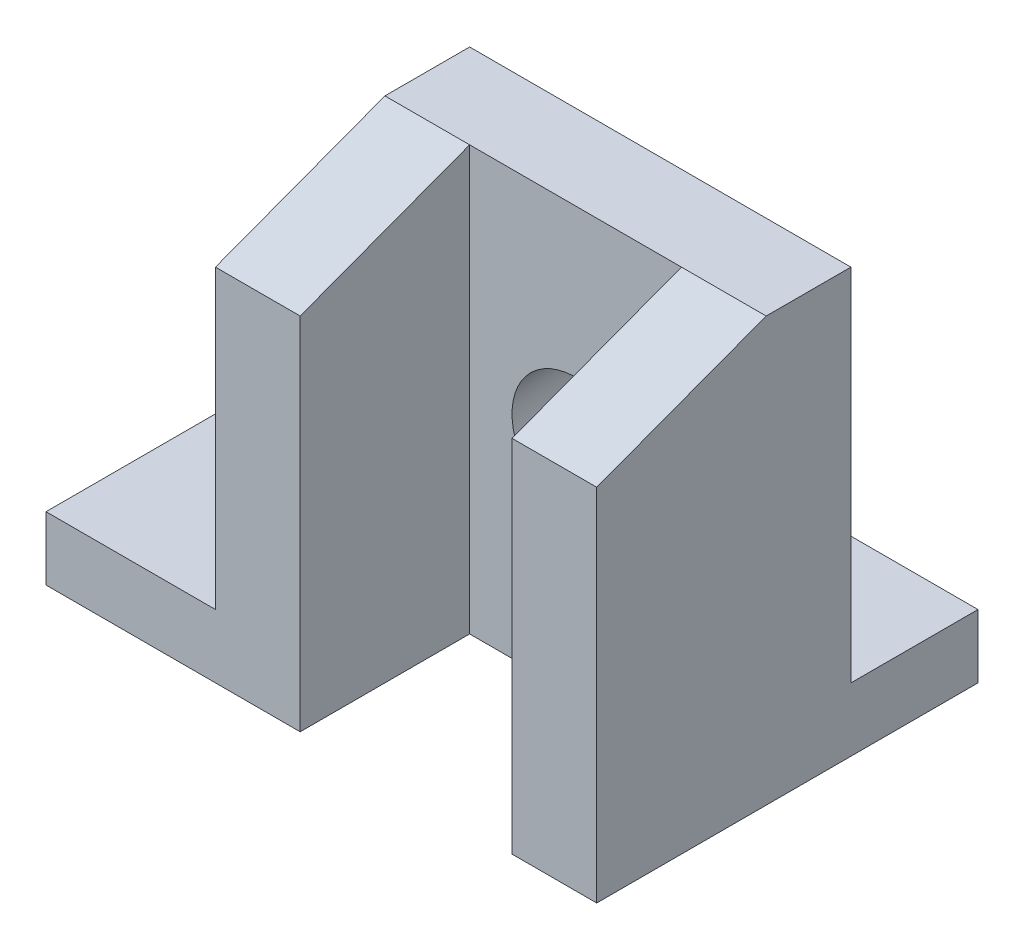
ISO-10303-21;
HEADER;
FILE_DESCRIPTION(('STEP AP214'),'2;1');
FILE_NAME('part.step','',(''),(''),'','','');
FILE_SCHEMA(('AUTOMOTIVE_DESIGN { 1 0 10303 214 1 1 1 1 }'));
ENDSEC;
DATA;
#1=APPLICATION_CONTEXT('core data for automotive mechanical design processes');
#2=APPLICATION_PROTOCOL_DEFINITION('international standard','automotive_design',2000,#1);
#3=PRODUCT_CONTEXT('',#1,'mechanical');
#4=PRODUCT('Part','Part','',(#3));
#5=PRODUCT_RELATED_PRODUCT_CATEGORY('part','',(#4));
#6=PRODUCT_DEFINITION_FORMATION('','',#4);
#7=PRODUCT_DEFINITION_CONTEXT('part definition',#1,'design');
#8=PRODUCT_DEFINITION('design','',#6,#7);
#9=PRODUCT_DEFINITION_SHAPE('','',#8);
#10=(LENGTH_UNIT() NAMED_UNIT(*) SI_UNIT(.MILLI.,.METRE.));
#11=(NAMED_UNIT(*) PLANE_ANGLE_UNIT() SI_UNIT($,.RADIAN.));
#12=(NAMED_UNIT(*) SI_UNIT($,.STERADIAN.) SOLID_ANGLE_UNIT());
#13=UNCERTAINTY_MEASURE_WITH_UNIT(LENGTH_MEASURE(1.E-05),#10,'distance_accuracy_value','');
#14=(GEOMETRIC_REPRESENTATION_CONTEXT(3) GLOBAL_UNCERTAINTY_ASSIGNED_CONTEXT((#13)) GLOBAL_UNIT_ASSIGNED_CONTEXT((#10,
#11,#12)) REPRESENTATION_CONTEXT('',''));
#15=CARTESIAN_POINT('',(0.,0.,0.));
#16=DIRECTION('',(0.,0.,1.));
#17=DIRECTION('',(1.,0.,0.));
#18=AXIS2_PLACEMENT_3D('',#15,#16,#17);
#19=CARTESIAN_POINT('',(0.,0.,-8.));
#20=DIRECTION('',(0.,0.,-1.));
#21=DIRECTION('',(-1.,0.,0.));
#22=AXIS2_PLACEMENT_3D('',#19,#20,#21);
#23=PLANE('',#22);
#24=CARTESIAN_POINT('',(0.,0.,-8.));
#25=DIRECTION('',(0.,0.,1.));
#26=DIRECTION('',(1.,0.,0.));
#27=AXIS2_PLACEMENT_3D('',#24,#25,#26);
#28=CIRCLE('',#27,6.);
#29=CARTESIAN_POINT('',(6.,0.,-8.));
#30=VERTEX_POINT('',#29);
#31=EDGE_CURVE('E267',#30,#30,#28,.T.);
#32=ORIENTED_EDGE('',*,*,#31,.T.);
#33=EDGE_LOOP('',(#32));
#34=FACE_BOUND('',#33,.T.);
#35=DIRECTION('',(0.,1.,0.));
#36=VECTOR('',#35,1.);
#37=CARTESIAN_POINT('',(18.,-20.,-8.));
#38=LINE('',#37,#36);
#39=CARTESIAN_POINT('',(18.,-14.,-8.));
#40=VERTEX_POINT('',#39);
#41=CARTESIAN_POINT('',(18.,20.,-8.));
#42=VERTEX_POINT('',#41);
#43=EDGE_CURVE('E276',#40,#42,#38,.T.);
#44=ORIENTED_EDGE('',*,*,#43,.F.);
#45=DIRECTION('',(-1.,0.,0.));
#46=VECTOR('',#45,1.);
#47=CARTESIAN_POINT('',(18.,-14.,-8.));
#48=LINE('',#47,#46);
#49=CARTESIAN_POINT('',(-18.,-14.,-8.));
#50=VERTEX_POINT('',#49);
#51=EDGE_CURVE('E177',#40,#50,#48,.T.);
#52=ORIENTED_EDGE('',*,*,#51,.T.);
#53=DIRECTION('',(0.,-1.,0.));
#54=VECTOR('',#53,1.);
#55=CARTESIAN_POINT('',(-18.,-20.,-8.));
#56=LINE('',#55,#54);
#57=CARTESIAN_POINT('',(-18.,20.,-8.));
#58=VERTEX_POINT('',#57);
#59=EDGE_CURVE('E273',#58,#50,#56,.T.);
#60=ORIENTED_EDGE('',*,*,#59,.F.);
#61=DIRECTION('',(-1.,0.,0.));
#62=VECTOR('',#61,1.);
#63=CARTESIAN_POINT('',(-18.,20.,-8.));
#64=LINE('',#63,#62);
#65=EDGE_CURVE('E162',#42,#58,#64,.T.);
#66=ORIENTED_EDGE('',*,*,#65,.F.);
#67=EDGE_LOOP('',(#44,#52,#60,#66));
#68=FACE_BOUND('',#67,.T.);
#69=ADVANCED_FACE('F39',(#34,#68),#23,.T.);
#70=CARTESIAN_POINT('',(-18.,-20.,-8.));
#71=DIRECTION('',(-1.,0.,0.));
#72=DIRECTION('',(0.,-1.,0.));
#73=AXIS2_PLACEMENT_3D('',#70,#71,#72);
#74=PLANE('',#73);
#75=DIRECTION('',(0.,-1.,0.));
#76=VECTOR('',#75,1.);
#77=CARTESIAN_POINT('',(-18.,8.,4.));
#78=LINE('',#77,#76);
#79=CARTESIAN_POINT('',(-18.,8.,4.));
#80=VERTEX_POINT('',#79);
#81=CARTESIAN_POINT('',(-18.,-8.,4.));
#82=VERTEX_POINT('',#81);
#83=EDGE_CURVE('E56',#80,#82,#78,.T.);
#84=ORIENTED_EDGE('',*,*,#83,.F.);
#85=DIRECTION('',(0.,0.,-1.));
#86=VECTOR('',#85,1.);
#87=CARTESIAN_POINT('',(-18.,8.,4.));
#88=LINE('',#87,#86);
#89=CARTESIAN_POINT('',(-18.,8.,12.));
#90=VERTEX_POINT('',#89);
#91=EDGE_CURVE('E60',#90,#80,#88,.T.);
#92=ORIENTED_EDGE('',*,*,#91,.F.);
#93=DIRECTION('',(0.,1.,0.));
#94=VECTOR('',#93,1.);
#95=CARTESIAN_POINT('',(-18.,8.,12.));
#96=LINE('',#95,#94);
#97=CARTESIAN_POINT('',(-18.,-8.,12.));
#98=VERTEX_POINT('',#97);
#99=EDGE_CURVE('E209',#98,#90,#96,.T.);
#100=ORIENTED_EDGE('',*,*,#99,.F.);
#101=DIRECTION('',(0.,0.,1.));
#102=VECTOR('',#101,1.);
#103=CARTESIAN_POINT('',(-18.,-8.,4.));
#104=LINE('',#103,#102);
#105=EDGE_CURVE('E206',#82,#98,#104,.T.);
#106=ORIENTED_EDGE('',*,*,#105,.F.);
#107=EDGE_LOOP('',(#84,#92,#100,#106));
#108=FACE_BOUND('',#107,.T.);
#109=ORIENTED_EDGE('',*,*,#59,.T.);
#110=DIRECTION('',(0.,0.,-1.));
#111=VECTOR('',#110,1.);
#112=CARTESIAN_POINT('',(-18.,-14.,16.));
#113=LINE('',#112,#111);
#114=CARTESIAN_POINT('',(-18.,-14.,16.));
#115=VERTEX_POINT('',#114);
#116=EDGE_CURVE('E171',#115,#50,#113,.T.);
#117=ORIENTED_EDGE('',*,*,#116,.F.);
#118=DIRECTION('',(0.,-1.,0.));
#119=VECTOR('',#118,1.);
#120=CARTESIAN_POINT('',(-18.,14.,16.));
#121=LINE('',#120,#119);
#122=CARTESIAN_POINT('',(-18.,14.,16.));
#123=VERTEX_POINT('',#122);
#124=EDGE_CURVE('E224',#123,#115,#121,.T.);
#125=ORIENTED_EDGE('',*,*,#124,.F.);
#126=DIRECTION('',(0.,-0.351123441588392,0.936329177569045));
#127=VECTOR('',#126,1.);
#128=CARTESIAN_POINT('',(-18.,20.,0.));
#129=LINE('',#128,#127);
#130=CARTESIAN_POINT('',(-18.,20.,0.));
#131=VERTEX_POINT('',#130);
#132=EDGE_CURVE('E227',#131,#123,#129,.T.);
#133=ORIENTED_EDGE('',*,*,#132,.F.);
#134=DIRECTION('',(0.,0.,1.));
#135=VECTOR('',#134,1.);
#136=CARTESIAN_POINT('',(-18.,20.,-8.));
#137=LINE('',#136,#135);
#138=EDGE_CURVE('E11',#58,#131,#137,.T.);
#139=ORIENTED_EDGE('',*,*,#138,.F.);
#140=EDGE_LOOP('',(#109,#117,#125,#133,#139));
#141=FACE_BOUND('',#140,.T.);
#142=ADVANCED_FACE('F41',(#108,#141),#74,.T.);
#143=CARTESIAN_POINT('',(0.,0.,0.));
#144=DIRECTION('',(0.,0.,-1.));
#145=DIRECTION('',(-1.,0.,0.));
#146=AXIS2_PLACEMENT_3D('',#143,#144,#145);
#147=PLANE('',#146);
#148=CARTESIAN_POINT('',(0.,0.,0.));
#149=DIRECTION('',(0.,0.,1.));
#150=DIRECTION('',(1.,0.,0.));
#151=AXIS2_PLACEMENT_3D('',#148,#149,#150);
#152=CIRCLE('',#151,6.);
#153=CARTESIAN_POINT('',(6.,0.,0.));
#154=VERTEX_POINT('',#153);
#155=EDGE_CURVE('E266',#154,#154,#152,.T.);
#156=ORIENTED_EDGE('',*,*,#155,.F.);
#157=EDGE_LOOP('',(#156));
#158=FACE_BOUND('',#157,.T.);
#159=DIRECTION('',(0.,1.,0.));
#160=VECTOR('',#159,1.);
#161=CARTESIAN_POINT('',(-10.,20.,0.));
#162=LINE('',#161,#160);
#163=CARTESIAN_POINT('',(-10.,-20.,0.));
#164=VERTEX_POINT('',#163);
#165=CARTESIAN_POINT('',(-10.,20.,0.));
#166=VERTEX_POINT('',#165);
#167=EDGE_CURVE('E223',#164,#166,#162,.T.);
#168=ORIENTED_EDGE('',*,*,#167,.F.);
#169=DIRECTION('',(1.,0.,0.));
#170=VECTOR('',#169,1.);
#171=CARTESIAN_POINT('',(-18.,-20.,0.));
#172=LINE('',#171,#170);
#173=CARTESIAN_POINT('',(10.,-20.,0.));
#174=VERTEX_POINT('',#173);
#175=EDGE_CURVE('E270',#164,#174,#172,.T.);
#176=ORIENTED_EDGE('',*,*,#175,.T.);
#177=DIRECTION('',(0.,1.,0.));
#178=VECTOR('',#177,1.);
#179=CARTESIAN_POINT('',(10.,20.,0.));
#180=LINE('',#179,#178);
#181=CARTESIAN_POINT('',(10.,20.,0.));
#182=VERTEX_POINT('',#181);
#183=EDGE_CURVE('E248',#174,#182,#180,.T.);
#184=ORIENTED_EDGE('',*,*,#183,.T.);
#185=DIRECTION('',(-1.,0.,0.));
#186=VECTOR('',#185,1.);
#187=CARTESIAN_POINT('',(-18.,20.,0.));
#188=LINE('',#187,#186);
#189=EDGE_CURVE('E282',#182,#166,#188,.T.);
#190=ORIENTED_EDGE('',*,*,#189,.T.);
#191=EDGE_LOOP('',(#168,#176,#184,#190));
#192=FACE_BOUND('',#191,.T.);
#193=ADVANCED_FACE('F300',(#158,#192),#147,.F.);
#194=CARTESIAN_POINT('',(-18.,20.,-8.));
#195=DIRECTION('',(0.,1.,0.));
#196=DIRECTION('',(-1.,0.,0.));
#197=AXIS2_PLACEMENT_3D('',#194,#195,#196);
#198=PLANE('',#197);
#199=CARTESIAN_POINT('',(18.,20.,0.));
#200=VERTEX_POINT('',#199);
#201=EDGE_CURVE('E277',#200,#182,#188,.T.);
#202=ORIENTED_EDGE('',*,*,#201,.F.);
#203=DIRECTION('',(0.,0.,1.));
#204=VECTOR('',#203,1.);
#205=CARTESIAN_POINT('',(18.,20.,-8.));
#206=LINE('',#205,#204);
#207=EDGE_CURVE('E48',#42,#200,#206,.T.);
#208=ORIENTED_EDGE('',*,*,#207,.F.);
#209=ORIENTED_EDGE('',*,*,#65,.T.);
#210=ORIENTED_EDGE('',*,*,#138,.T.);
#211=DIRECTION('',(1.,0.,0.));
#212=VECTOR('',#211,1.);
#213=CARTESIAN_POINT('',(-18.,20.,0.));
#214=LINE('',#213,#212);
#215=EDGE_CURVE('E231',#131,#166,#214,.T.);
#216=ORIENTED_EDGE('',*,*,#215,.T.);
#217=ORIENTED_EDGE('',*,*,#189,.F.);
#218=EDGE_LOOP('',(#202,#208,#209,#210,#216,#217));
#219=FACE_BOUND('',#218,.T.);
#220=ADVANCED_FACE('F290',(#219),#198,.T.);
#221=CARTESIAN_POINT('',(18.,-20.,-8.));
#222=DIRECTION('',(1.,0.,0.));
#223=DIRECTION('',(0.,1.,0.));
#224=AXIS2_PLACEMENT_3D('',#221,#222,#223);
#225=PLANE('',#224);
#226=ORIENTED_EDGE('',*,*,#207,.T.);
#227=DIRECTION('',(0.,-0.351123441588392,0.936329177569045));
#228=VECTOR('',#227,1.);
#229=CARTESIAN_POINT('',(18.,20.,0.));
#230=LINE('',#229,#228);
#231=CARTESIAN_POINT('',(18.,14.,16.));
#232=VERTEX_POINT('',#231);
#233=EDGE_CURVE('E249',#200,#232,#230,.T.);
#234=ORIENTED_EDGE('',*,*,#233,.T.);
#235=DIRECTION('',(0.,-1.,0.));
#236=VECTOR('',#235,1.);
#237=CARTESIAN_POINT('',(18.,14.,16.));
#238=LINE('',#237,#236);
#239=CARTESIAN_POINT('',(18.,-20.,16.));
#240=VERTEX_POINT('',#239);
#241=EDGE_CURVE('E158',#232,#240,#238,.T.);
#242=ORIENTED_EDGE('',*,*,#241,.T.);
#243=DIRECTION('',(0.,0.,1.));
#244=VECTOR('',#243,1.);
#245=CARTESIAN_POINT('',(18.,-20.,-8.));
#246=LINE('',#245,#244);
#247=CARTESIAN_POINT('',(18.,-20.,-20.));
#248=VERTEX_POINT('',#247);
#249=EDGE_CURVE('E43',#248,#240,#246,.T.);
#250=ORIENTED_EDGE('',*,*,#249,.F.);
#251=DIRECTION('',(0.,1.,0.));
#252=VECTOR('',#251,1.);
#253=CARTESIAN_POINT('',(18.,-14.,-20.));
#254=LINE('',#253,#252);
#255=CARTESIAN_POINT('',(18.,-14.,-20.));
#256=VERTEX_POINT('',#255);
#257=EDGE_CURVE('E155',#248,#256,#254,.T.);
#258=ORIENTED_EDGE('',*,*,#257,.T.);
#259=DIRECTION('',(0.,0.,1.));
#260=VECTOR('',#259,1.);
#261=CARTESIAN_POINT('',(18.,-14.,-8.));
#262=LINE('',#261,#260);
#263=EDGE_CURVE('E175',#256,#40,#262,.T.);
#264=ORIENTED_EDGE('',*,*,#263,.T.);
#265=ORIENTED_EDGE('',*,*,#43,.T.);
#266=EDGE_LOOP('',(#226,#234,#242,#250,#258,#264,#265));
#267=FACE_BOUND('',#266,.T.);
#268=ADVANCED_FACE('F153',(#267),#225,.T.);
#269=CARTESIAN_POINT('',(-18.,-20.,-8.));
#270=DIRECTION('',(0.,-1.,0.));
#271=DIRECTION('',(1.,0.,0.));
#272=AXIS2_PLACEMENT_3D('',#269,#270,#271);
#273=PLANE('',#272);
#274=DIRECTION('',(-1.,0.,0.));
#275=VECTOR('',#274,1.);
#276=CARTESIAN_POINT('',(18.4965751817893,-20.,-20.));
#277=LINE('',#276,#275);
#278=CARTESIAN_POINT('',(-34.,-20.,-20.));
#279=VERTEX_POINT('',#278);
#280=EDGE_CURVE('E164',#248,#279,#277,.T.);
#281=ORIENTED_EDGE('',*,*,#280,.F.);
#282=ORIENTED_EDGE('',*,*,#249,.T.);
#283=DIRECTION('',(-1.,0.,0.));
#284=VECTOR('',#283,1.);
#285=CARTESIAN_POINT('',(18.,-20.,16.));
#286=LINE('',#285,#284);
#287=CARTESIAN_POINT('',(10.,-20.,16.));
#288=VERTEX_POINT('',#287);
#289=EDGE_CURVE('E253',#240,#288,#286,.T.);
#290=ORIENTED_EDGE('',*,*,#289,.T.);
#291=DIRECTION('',(0.,0.,-1.));
#292=VECTOR('',#291,1.);
#293=CARTESIAN_POINT('',(10.,-20.,16.));
#294=LINE('',#293,#292);
#295=EDGE_CURVE('E251',#288,#174,#294,.T.);
#296=ORIENTED_EDGE('',*,*,#295,.T.);
#297=ORIENTED_EDGE('',*,*,#175,.F.);
#298=DIRECTION('',(0.,0.,-1.));
#299=VECTOR('',#298,1.);
#300=CARTESIAN_POINT('',(-10.,-20.,16.));
#301=LINE('',#300,#299);
#302=CARTESIAN_POINT('',(-10.,-20.,16.));
#303=VERTEX_POINT('',#302);
#304=EDGE_CURVE('E234',#303,#164,#301,.T.);
#305=ORIENTED_EDGE('',*,*,#304,.F.);
#306=DIRECTION('',(1.,0.,0.));
#307=VECTOR('',#306,1.);
#308=CARTESIAN_POINT('',(-18.,-20.,16.));
#309=LINE('',#308,#307);
#310=CARTESIAN_POINT('',(-34.,-20.,16.));
#311=VERTEX_POINT('',#310);
#312=EDGE_CURVE('E246',#311,#303,#309,.T.);
#313=ORIENTED_EDGE('',*,*,#312,.F.);
#314=DIRECTION('',(0.,0.,-1.));
#315=VECTOR('',#314,1.);
#316=CARTESIAN_POINT('',(-34.,-20.,16.));
#317=LINE('',#316,#315);
#318=EDGE_CURVE('E167',#311,#279,#317,.T.);
#319=ORIENTED_EDGE('',*,*,#318,.T.);
#320=EDGE_LOOP('',(#281,#282,#290,#296,#297,#305,#313,#319));
#321=FACE_BOUND('',#320,.T.);
#322=ADVANCED_FACE('F165',(#321),#273,.T.);
#323=CARTESIAN_POINT('',(0.,0.,-8.));
#324=DIRECTION('',(0.,0.,1.));
#325=DIRECTION('',(1.,0.,0.));
#326=AXIS2_PLACEMENT_3D('',#323,#324,#325);
#327=CYLINDRICAL_SURFACE('',#326,6.);
#328=ORIENTED_EDGE('',*,*,#31,.F.);
#329=EDGE_LOOP('',(#328));
#330=FACE_BOUND('',#329,.T.);
#331=ORIENTED_EDGE('',*,*,#155,.T.);
#332=EDGE_LOOP('',(#331));
#333=FACE_BOUND('',#332,.T.);
#334=ADVANCED_FACE('F313',(#330,#333),#327,.F.);
#335=CARTESIAN_POINT('',(18.,20.,0.));
#336=DIRECTION('',(0.,-0.936329177569045,-0.351123441588392));
#337=DIRECTION('',(0.,0.351123441588392,-0.936329177569045));
#338=AXIS2_PLACEMENT_3D('',#335,#336,#337);
#339=PLANE('',#338);
#340=DIRECTION('',(0.,-0.351123441588392,0.936329177569045));
#341=VECTOR('',#340,1.);
#342=CARTESIAN_POINT('',(10.,20.,0.));
#343=LINE('',#342,#341);
#344=CARTESIAN_POINT('',(10.,14.,16.));
#345=VERTEX_POINT('',#344);
#346=EDGE_CURVE('E256',#182,#345,#343,.T.);
#347=ORIENTED_EDGE('',*,*,#346,.T.);
#348=DIRECTION('',(-1.,0.,0.));
#349=VECTOR('',#348,1.);
#350=CARTESIAN_POINT('',(18.,14.,16.));
#351=LINE('',#350,#349);
#352=EDGE_CURVE('E263',#232,#345,#351,.T.);
#353=ORIENTED_EDGE('',*,*,#352,.F.);
#354=ORIENTED_EDGE('',*,*,#233,.F.);
#355=ORIENTED_EDGE('',*,*,#201,.T.);
#356=EDGE_LOOP('',(#347,#353,#354,#355));
#357=FACE_BOUND('',#356,.T.);
#358=ADVANCED_FACE('F293',(#357),#339,.F.);
#359=CARTESIAN_POINT('',(18.,14.,16.));
#360=DIRECTION('',(0.,0.,-1.));
#361=DIRECTION('',(-1.,0.,0.));
#362=AXIS2_PLACEMENT_3D('',#359,#360,#361);
#363=PLANE('',#362);
#364=DIRECTION('',(0.,-1.,0.));
#365=VECTOR('',#364,1.);
#366=CARTESIAN_POINT('',(10.,14.,16.));
#367=LINE('',#366,#365);
#368=EDGE_CURVE('E258',#345,#288,#367,.T.);
#369=ORIENTED_EDGE('',*,*,#368,.T.);
#370=ORIENTED_EDGE('',*,*,#289,.F.);
#371=ORIENTED_EDGE('',*,*,#241,.F.);
#372=ORIENTED_EDGE('',*,*,#352,.T.);
#373=EDGE_LOOP('',(#369,#370,#371,#372));
#374=FACE_BOUND('',#373,.T.);
#375=ADVANCED_FACE('F304',(#374),#363,.F.);
#376=CARTESIAN_POINT('',(10.,0.,0.));
#377=DIRECTION('',(1.,0.,0.));
#378=DIRECTION('',(0.,0.,-1.));
#379=AXIS2_PLACEMENT_3D('',#376,#377,#378);
#380=PLANE('',#379);
#381=ORIENTED_EDGE('',*,*,#183,.F.);
#382=ORIENTED_EDGE('',*,*,#295,.F.);
#383=ORIENTED_EDGE('',*,*,#368,.F.);
#384=ORIENTED_EDGE('',*,*,#346,.F.);
#385=EDGE_LOOP('',(#381,#382,#383,#384));
#386=FACE_BOUND('',#385,.T.);
#387=ADVANCED_FACE('F297',(#386),#380,.F.);
#388=CARTESIAN_POINT('',(-18.,14.,16.));
#389=DIRECTION('',(0.,0.,1.));
#390=DIRECTION('',(1.,0.,0.));
#391=AXIS2_PLACEMENT_3D('',#388,#389,#390);
#392=PLANE('',#391);
#393=DIRECTION('',(0.,-1.,0.));
#394=VECTOR('',#393,1.);
#395=CARTESIAN_POINT('',(-10.,14.,16.));
#396=LINE('',#395,#394);
#397=CARTESIAN_POINT('',(-10.,14.,16.));
#398=VERTEX_POINT('',#397);
#399=EDGE_CURVE('E237',#398,#303,#396,.T.);
#400=ORIENTED_EDGE('',*,*,#399,.F.);
#401=DIRECTION('',(1.,0.,0.));
#402=VECTOR('',#401,1.);
#403=CARTESIAN_POINT('',(-18.,14.,16.));
#404=LINE('',#403,#402);
#405=EDGE_CURVE('E244',#123,#398,#404,.T.);
#406=ORIENTED_EDGE('',*,*,#405,.F.);
#407=ORIENTED_EDGE('',*,*,#124,.T.);
#408=DIRECTION('',(-1.,0.,0.));
#409=VECTOR('',#408,1.);
#410=CARTESIAN_POINT('',(18.4965751817893,-14.,16.));
#411=LINE('',#410,#409);
#412=CARTESIAN_POINT('',(-34.,-14.,16.));
#413=VERTEX_POINT('',#412);
#414=EDGE_CURVE('E190',#115,#413,#411,.T.);
#415=ORIENTED_EDGE('',*,*,#414,.T.);
#416=DIRECTION('',(0.,-1.,0.));
#417=VECTOR('',#416,1.);
#418=CARTESIAN_POINT('',(-34.,-20.,16.));
#419=LINE('',#418,#417);
#420=EDGE_CURVE('E181',#413,#311,#419,.T.);
#421=ORIENTED_EDGE('',*,*,#420,.T.);
#422=ORIENTED_EDGE('',*,*,#312,.T.);
#423=EDGE_LOOP('',(#400,#406,#407,#415,#421,#422));
#424=FACE_BOUND('',#423,.T.);
#425=ADVANCED_FACE('F311',(#424),#392,.T.);
#426=CARTESIAN_POINT('',(-18.,20.,0.));
#427=DIRECTION('',(0.,0.936329177569045,0.351123441588392));
#428=DIRECTION('',(0.,-0.351123441588392,0.936329177569045));
#429=AXIS2_PLACEMENT_3D('',#426,#427,#428);
#430=PLANE('',#429);
#431=DIRECTION('',(0.,-0.351123441588392,0.936329177569045));
#432=VECTOR('',#431,1.);
#433=CARTESIAN_POINT('',(-10.,20.,0.));
#434=LINE('',#433,#432);
#435=EDGE_CURVE('E228',#166,#398,#434,.T.);
#436=ORIENTED_EDGE('',*,*,#435,.F.);
#437=ORIENTED_EDGE('',*,*,#215,.F.);
#438=ORIENTED_EDGE('',*,*,#132,.T.);
#439=ORIENTED_EDGE('',*,*,#405,.T.);
#440=EDGE_LOOP('',(#436,#437,#438,#439));
#441=FACE_BOUND('',#440,.T.);
#442=ADVANCED_FACE('F385',(#441),#430,.T.);
#443=CARTESIAN_POINT('',(-10.,0.,0.));
#444=DIRECTION('',(-1.,0.,0.));
#445=DIRECTION('',(0.,0.,-1.));
#446=AXIS2_PLACEMENT_3D('',#443,#444,#445);
#447=PLANE('',#446);
#448=ORIENTED_EDGE('',*,*,#167,.T.);
#449=ORIENTED_EDGE('',*,*,#435,.T.);
#450=ORIENTED_EDGE('',*,*,#399,.T.);
#451=ORIENTED_EDGE('',*,*,#304,.T.);
#452=EDGE_LOOP('',(#448,#449,#450,#451));
#453=FACE_BOUND('',#452,.T.);
#454=ADVANCED_FACE('F397',(#453),#447,.F.);
#455=CARTESIAN_POINT('',(-22.,8.,4.));
#456=DIRECTION('',(0.,0.,1.));
#457=DIRECTION('',(0.,-1.,0.));
#458=AXIS2_PLACEMENT_3D('',#455,#456,#457);
#459=PLANE('',#458);
#460=ORIENTED_EDGE('',*,*,#83,.T.);
#461=DIRECTION('',(1.,0.,0.));
#462=VECTOR('',#461,1.);
#463=CARTESIAN_POINT('',(-22.,-8.,4.));
#464=LINE('',#463,#462);
#465=CARTESIAN_POINT('',(-22.,-8.,4.));
#466=VERTEX_POINT('',#465);
#467=EDGE_CURVE('E220',#466,#82,#464,.T.);
#468=ORIENTED_EDGE('',*,*,#467,.F.);
#469=DIRECTION('',(0.,-1.,0.));
#470=VECTOR('',#469,1.);
#471=CARTESIAN_POINT('',(-22.,8.,4.));
#472=LINE('',#471,#470);
#473=CARTESIAN_POINT('',(-22.,8.,4.));
#474=VERTEX_POINT('',#473);
#475=EDGE_CURVE('E195',#474,#466,#472,.T.);
#476=ORIENTED_EDGE('',*,*,#475,.F.);
#477=DIRECTION('',(1.,0.,0.));
#478=VECTOR('',#477,1.);
#479=CARTESIAN_POINT('',(-22.,8.,4.));
#480=LINE('',#479,#478);
#481=EDGE_CURVE('E204',#474,#80,#480,.T.);
#482=ORIENTED_EDGE('',*,*,#481,.T.);
#483=EDGE_LOOP('',(#460,#468,#476,#482));
#484=FACE_BOUND('',#483,.T.);
#485=ADVANCED_FACE('F407',(#484),#459,.F.);
#486=CARTESIAN_POINT('',(-22.,-8.,4.));
#487=DIRECTION('',(0.,1.,0.));
#488=DIRECTION('',(-1.,0.,0.));
#489=AXIS2_PLACEMENT_3D('',#486,#487,#488);
#490=PLANE('',#489);
#491=ORIENTED_EDGE('',*,*,#105,.T.);
#492=DIRECTION('',(1.,0.,0.));
#493=VECTOR('',#492,1.);
#494=CARTESIAN_POINT('',(-22.,-8.,12.));
#495=LINE('',#494,#493);
#496=CARTESIAN_POINT('',(-22.,-8.,12.));
#497=VERTEX_POINT('',#496);
#498=EDGE_CURVE('E217',#497,#98,#495,.T.);
#499=ORIENTED_EDGE('',*,*,#498,.F.);
#500=DIRECTION('',(0.,0.,1.));
#501=VECTOR('',#500,1.);
#502=CARTESIAN_POINT('',(-22.,-8.,4.));
#503=LINE('',#502,#501);
#504=EDGE_CURVE('E198',#466,#497,#503,.T.);
#505=ORIENTED_EDGE('',*,*,#504,.F.);
#506=ORIENTED_EDGE('',*,*,#467,.T.);
#507=EDGE_LOOP('',(#491,#499,#505,#506));
#508=FACE_BOUND('',#507,.T.);
#509=ADVANCED_FACE('F417',(#508),#490,.F.);
#510=CARTESIAN_POINT('',(-22.,8.,12.));
#511=DIRECTION('',(0.,0.,-1.));
#512=DIRECTION('',(0.,1.,0.));
#513=AXIS2_PLACEMENT_3D('',#510,#511,#512);
#514=PLANE('',#513);
#515=ORIENTED_EDGE('',*,*,#99,.T.);
#516=DIRECTION('',(1.,0.,0.));
#517=VECTOR('',#516,1.);
#518=CARTESIAN_POINT('',(-22.,8.,12.));
#519=LINE('',#518,#517);
#520=CARTESIAN_POINT('',(-22.,8.,12.));
#521=VERTEX_POINT('',#520);
#522=EDGE_CURVE('E214',#521,#90,#519,.T.);
#523=ORIENTED_EDGE('',*,*,#522,.F.);
#524=DIRECTION('',(0.,1.,0.));
#525=VECTOR('',#524,1.);
#526=CARTESIAN_POINT('',(-22.,8.,12.));
#527=LINE('',#526,#525);
#528=EDGE_CURVE('E200',#497,#521,#527,.T.);
#529=ORIENTED_EDGE('',*,*,#528,.F.);
#530=ORIENTED_EDGE('',*,*,#498,.T.);
#531=EDGE_LOOP('',(#515,#523,#529,#530));
#532=FACE_BOUND('',#531,.T.);
#533=ADVANCED_FACE('F427',(#532),#514,.F.);
#534=CARTESIAN_POINT('',(-22.,8.,4.));
#535=DIRECTION('',(0.,-1.,0.));
#536=DIRECTION('',(0.,0.,-1.));
#537=AXIS2_PLACEMENT_3D('',#534,#535,#536);
#538=PLANE('',#537);
#539=ORIENTED_EDGE('',*,*,#91,.T.);
#540=ORIENTED_EDGE('',*,*,#481,.F.);
#541=DIRECTION('',(0.,0.,-1.));
#542=VECTOR('',#541,1.);
#543=CARTESIAN_POINT('',(-22.,8.,4.));
#544=LINE('',#543,#542);
#545=EDGE_CURVE('E202',#521,#474,#544,.T.);
#546=ORIENTED_EDGE('',*,*,#545,.F.);
#547=ORIENTED_EDGE('',*,*,#522,.T.);
#548=EDGE_LOOP('',(#539,#540,#546,#547));
#549=FACE_BOUND('',#548,.T.);
#550=ADVANCED_FACE('F437',(#549),#538,.F.);
#551=CARTESIAN_POINT('',(-22.,0.,0.));
#552=DIRECTION('',(-1.,0.,0.));
#553=DIRECTION('',(0.,0.,1.));
#554=AXIS2_PLACEMENT_3D('',#551,#552,#553);
#555=PLANE('',#554);
#556=ORIENTED_EDGE('',*,*,#475,.T.);
#557=ORIENTED_EDGE('',*,*,#504,.T.);
#558=ORIENTED_EDGE('',*,*,#528,.T.);
#559=ORIENTED_EDGE('',*,*,#545,.T.);
#560=EDGE_LOOP('',(#556,#557,#558,#559));
#561=FACE_BOUND('',#560,.T.);
#562=ADVANCED_FACE('F447',(#561),#555,.T.);
#563=CARTESIAN_POINT('',(-34.,0.,0.));
#564=DIRECTION('',(-1.,0.,0.));
#565=DIRECTION('',(0.,0.,1.));
#566=AXIS2_PLACEMENT_3D('',#563,#564,#565);
#567=PLANE('',#566);
#568=ORIENTED_EDGE('',*,*,#420,.F.);
#569=DIRECTION('',(0.,0.,1.));
#570=VECTOR('',#569,1.);
#571=CARTESIAN_POINT('',(-34.,-14.,16.));
#572=LINE('',#571,#570);
#573=CARTESIAN_POINT('',(-34.,-14.,-20.));
#574=VERTEX_POINT('',#573);
#575=EDGE_CURVE('E187',#574,#413,#572,.T.);
#576=ORIENTED_EDGE('',*,*,#575,.F.);
#577=DIRECTION('',(0.,1.,0.));
#578=VECTOR('',#577,1.);
#579=CARTESIAN_POINT('',(-34.,-20.,-20.));
#580=LINE('',#579,#578);
#581=EDGE_CURVE('E185',#279,#574,#580,.T.);
#582=ORIENTED_EDGE('',*,*,#581,.F.);
#583=ORIENTED_EDGE('',*,*,#318,.F.);
#584=EDGE_LOOP('',(#568,#576,#582,#583));
#585=FACE_BOUND('',#584,.T.);
#586=ADVANCED_FACE('F457',(#585),#567,.T.);
#587=CARTESIAN_POINT('',(18.4965751817893,-14.,16.));
#588=DIRECTION('',(0.,-1.,0.));
#589=DIRECTION('',(1.,0.,0.));
#590=AXIS2_PLACEMENT_3D('',#587,#588,#589);
#591=PLANE('',#590);
#592=ORIENTED_EDGE('',*,*,#414,.F.);
#593=ORIENTED_EDGE('',*,*,#116,.T.);
#594=ORIENTED_EDGE('',*,*,#51,.F.);
#595=ORIENTED_EDGE('',*,*,#263,.F.);
#596=DIRECTION('',(-1.,0.,0.));
#597=VECTOR('',#596,1.);
#598=CARTESIAN_POINT('',(18.4965751817893,-14.,-20.));
#599=LINE('',#598,#597);
#600=EDGE_CURVE('E172',#256,#574,#599,.T.);
#601=ORIENTED_EDGE('',*,*,#600,.T.);
#602=ORIENTED_EDGE('',*,*,#575,.T.);
#603=EDGE_LOOP('',(#592,#593,#594,#595,#601,#602));
#604=FACE_BOUND('',#603,.T.);
#605=ADVANCED_FACE('F472',(#604),#591,.F.);
#606=CARTESIAN_POINT('',(18.4965751817893,-20.,-20.));
#607=DIRECTION('',(0.,0.,1.));
#608=DIRECTION('',(1.,0.,0.));
#609=AXIS2_PLACEMENT_3D('',#606,#607,#608);
#610=PLANE('',#609);
#611=ORIENTED_EDGE('',*,*,#600,.F.);
#612=ORIENTED_EDGE('',*,*,#257,.F.);
#613=ORIENTED_EDGE('',*,*,#280,.T.);
#614=ORIENTED_EDGE('',*,*,#581,.T.);
#615=EDGE_LOOP('',(#611,#612,#613,#614));
#616=FACE_BOUND('',#615,.T.);
#617=ADVANCED_FACE('F174',(#616),#610,.F.);
#618=CLOSED_SHELL('',(#69,#142,#193,#220,#268,#322,#334,#358,#375,#387,#425,#442,#454,#485,#509,
#533,#550,#562,#586,#605,#617));
#619=MANIFOLD_SOLID_BREP('B2',#618);
#620=ADVANCED_BREP_SHAPE_REPRESENTATION('',(#18,#619),#14);
#621=SHAPE_DEFINITION_REPRESENTATION(#9,#620);
ENDSEC;
END-ISO-10303-21;
